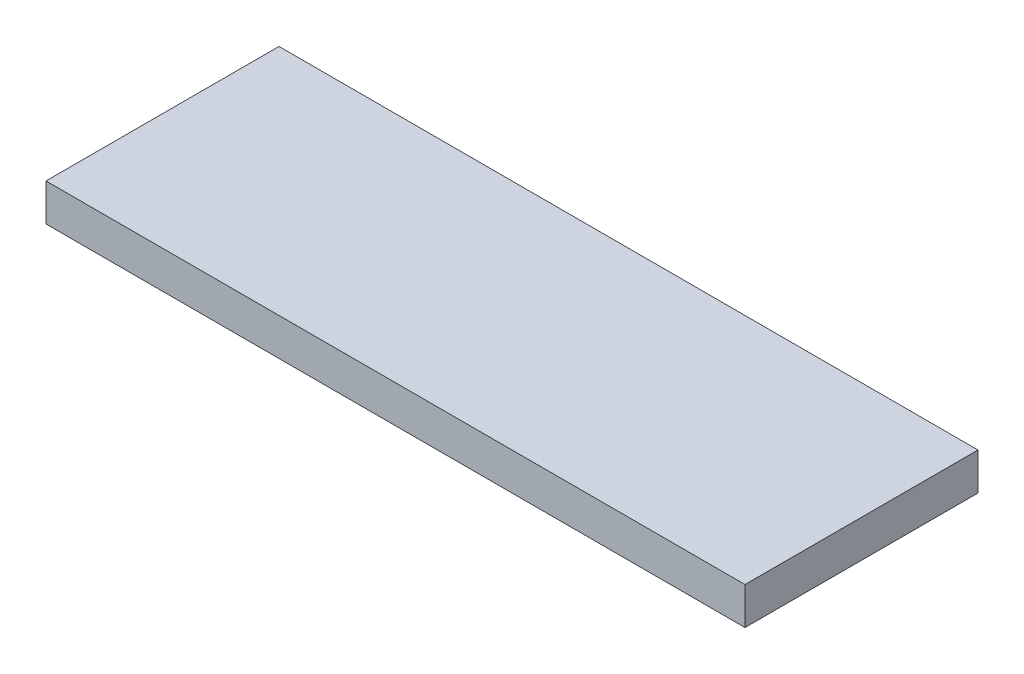
ISO-10303-21;
HEADER;
FILE_DESCRIPTION(('STEP AP214'),'2;1');
FILE_NAME('part.step','',(''),(''),'','','');
FILE_SCHEMA(('AUTOMOTIVE_DESIGN { 1 0 10303 214 1 1 1 1 }'));
ENDSEC;
DATA;
#1=APPLICATION_CONTEXT('core data for automotive mechanical design processes');
#2=APPLICATION_PROTOCOL_DEFINITION('international standard','automotive_design',2000,#1);
#3=PRODUCT_CONTEXT('',#1,'mechanical');
#4=PRODUCT('Part','Part','',(#3));
#5=PRODUCT_RELATED_PRODUCT_CATEGORY('part','',(#4));
#6=PRODUCT_DEFINITION_FORMATION('','',#4);
#7=PRODUCT_DEFINITION_CONTEXT('part definition',#1,'design');
#8=PRODUCT_DEFINITION('design','',#6,#7);
#9=PRODUCT_DEFINITION_SHAPE('','',#8);
#10=(LENGTH_UNIT() NAMED_UNIT(*) SI_UNIT(.MILLI.,.METRE.));
#11=(NAMED_UNIT(*) PLANE_ANGLE_UNIT() SI_UNIT($,.RADIAN.));
#12=(NAMED_UNIT(*) SI_UNIT($,.STERADIAN.) SOLID_ANGLE_UNIT());
#13=UNCERTAINTY_MEASURE_WITH_UNIT(LENGTH_MEASURE(1.E-05),#10,'distance_accuracy_value','');
#14=(GEOMETRIC_REPRESENTATION_CONTEXT(3) GLOBAL_UNCERTAINTY_ASSIGNED_CONTEXT((#13)) GLOBAL_UNIT_ASSIGNED_CONTEXT((#10,
#11,#12)) REPRESENTATION_CONTEXT('',''));
#15=CARTESIAN_POINT('',(0.,0.,0.));
#16=DIRECTION('',(0.,0.,1.));
#17=DIRECTION('',(1.,0.,0.));
#18=AXIS2_PLACEMENT_3D('',#15,#16,#17);
#19=CARTESIAN_POINT('',(-75.,8.,25.));
#20=DIRECTION('',(1.,0.,0.));
#21=DIRECTION('',(0.,0.,-1.));
#22=AXIS2_PLACEMENT_3D('',#19,#20,#21);
#23=PLANE('',#22);
#24=DIRECTION('',(0.,0.,1.));
#25=VECTOR('',#24,1.);
#26=CARTESIAN_POINT('',(-75.,0.,25.));
#27=LINE('',#26,#25);
#28=CARTESIAN_POINT('',(-75.,0.,-25.));
#29=VERTEX_POINT('',#28);
#30=CARTESIAN_POINT('',(-75.,0.,25.));
#31=VERTEX_POINT('',#30);
#32=EDGE_CURVE('E96',#29,#31,#27,.T.);
#33=ORIENTED_EDGE('',*,*,#32,.T.);
#34=DIRECTION('',(0.,-1.,0.));
#35=VECTOR('',#34,1.);
#36=CARTESIAN_POINT('',(-75.,8.,25.));
#37=LINE('',#36,#35);
#38=CARTESIAN_POINT('',(-75.,8.,25.));
#39=VERTEX_POINT('',#38);
#40=EDGE_CURVE('E11',#39,#31,#37,.T.);
#41=ORIENTED_EDGE('',*,*,#40,.F.);
#42=DIRECTION('',(0.,0.,1.));
#43=VECTOR('',#42,1.);
#44=CARTESIAN_POINT('',(-75.,8.,25.));
#45=LINE('',#44,#43);
#46=CARTESIAN_POINT('',(-75.,8.,-25.));
#47=VERTEX_POINT('',#46);
#48=EDGE_CURVE('E84',#47,#39,#45,.T.);
#49=ORIENTED_EDGE('',*,*,#48,.F.);
#50=DIRECTION('',(0.,-1.,0.));
#51=VECTOR('',#50,1.);
#52=CARTESIAN_POINT('',(-75.,8.,-25.));
#53=LINE('',#52,#51);
#54=EDGE_CURVE('E92',#47,#29,#53,.T.);
#55=ORIENTED_EDGE('',*,*,#54,.T.);
#56=EDGE_LOOP('',(#33,#41,#49,#55));
#57=FACE_BOUND('',#56,.T.);
#58=ADVANCED_FACE('F33',(#57),#23,.F.);
#59=CARTESIAN_POINT('',(75.,8.,25.));
#60=DIRECTION('',(0.,0.,-1.));
#61=DIRECTION('',(-1.,0.,0.));
#62=AXIS2_PLACEMENT_3D('',#59,#60,#61);
#63=PLANE('',#62);
#64=DIRECTION('',(1.,0.,0.));
#65=VECTOR('',#64,1.);
#66=CARTESIAN_POINT('',(75.,0.,25.));
#67=LINE('',#66,#65);
#68=CARTESIAN_POINT('',(75.,0.,25.));
#69=VERTEX_POINT('',#68);
#70=EDGE_CURVE('E88',#31,#69,#67,.T.);
#71=ORIENTED_EDGE('',*,*,#70,.T.);
#72=DIRECTION('',(0.,-1.,0.));
#73=VECTOR('',#72,1.);
#74=CARTESIAN_POINT('',(75.,8.,25.));
#75=LINE('',#74,#73);
#76=CARTESIAN_POINT('',(75.,8.,25.));
#77=VERTEX_POINT('',#76);
#78=EDGE_CURVE('E41',#77,#69,#75,.T.);
#79=ORIENTED_EDGE('',*,*,#78,.F.);
#80=DIRECTION('',(1.,0.,0.));
#81=VECTOR('',#80,1.);
#82=CARTESIAN_POINT('',(75.,8.,25.));
#83=LINE('',#82,#81);
#84=EDGE_CURVE('E79',#39,#77,#83,.T.);
#85=ORIENTED_EDGE('',*,*,#84,.F.);
#86=ORIENTED_EDGE('',*,*,#40,.T.);
#87=EDGE_LOOP('',(#71,#79,#85,#86));
#88=FACE_BOUND('',#87,.T.);
#89=ADVANCED_FACE('F87',(#88),#63,.F.);
#90=CARTESIAN_POINT('',(75.,8.,25.));
#91=DIRECTION('',(-1.,0.,0.));
#92=DIRECTION('',(0.,0.,1.));
#93=AXIS2_PLACEMENT_3D('',#90,#91,#92);
#94=PLANE('',#93);
#95=DIRECTION('',(0.,0.,-1.));
#96=VECTOR('',#95,1.);
#97=CARTESIAN_POINT('',(75.,0.,25.));
#98=LINE('',#97,#96);
#99=CARTESIAN_POINT('',(75.,0.,-25.));
#100=VERTEX_POINT('',#99);
#101=EDGE_CURVE('E66',#69,#100,#98,.T.);
#102=ORIENTED_EDGE('',*,*,#101,.T.);
#103=DIRECTION('',(0.,-1.,0.));
#104=VECTOR('',#103,1.);
#105=CARTESIAN_POINT('',(75.,8.,-25.));
#106=LINE('',#105,#104);
#107=CARTESIAN_POINT('',(75.,8.,-25.));
#108=VERTEX_POINT('',#107);
#109=EDGE_CURVE('E89',#108,#100,#106,.T.);
#110=ORIENTED_EDGE('',*,*,#109,.F.);
#111=DIRECTION('',(0.,0.,-1.));
#112=VECTOR('',#111,1.);
#113=CARTESIAN_POINT('',(75.,8.,25.));
#114=LINE('',#113,#112);
#115=EDGE_CURVE('E82',#77,#108,#114,.T.);
#116=ORIENTED_EDGE('',*,*,#115,.F.);
#117=ORIENTED_EDGE('',*,*,#78,.T.);
#118=EDGE_LOOP('',(#102,#110,#116,#117));
#119=FACE_BOUND('',#118,.T.);
#120=ADVANCED_FACE('F90',(#119),#94,.F.);
#121=CARTESIAN_POINT('',(75.,8.,-25.));
#122=DIRECTION('',(0.,0.,1.));
#123=DIRECTION('',(1.,0.,0.));
#124=AXIS2_PLACEMENT_3D('',#121,#122,#123);
#125=PLANE('',#124);
#126=DIRECTION('',(-1.,0.,0.));
#127=VECTOR('',#126,1.);
#128=CARTESIAN_POINT('',(75.,0.,-25.));
#129=LINE('',#128,#127);
#130=EDGE_CURVE('E72',#100,#29,#129,.T.);
#131=ORIENTED_EDGE('',*,*,#130,.T.);
#132=ORIENTED_EDGE('',*,*,#54,.F.);
#133=DIRECTION('',(-1.,0.,0.));
#134=VECTOR('',#133,1.);
#135=CARTESIAN_POINT('',(75.,8.,-25.));
#136=LINE('',#135,#134);
#137=EDGE_CURVE('E49',#108,#47,#136,.T.);
#138=ORIENTED_EDGE('',*,*,#137,.F.);
#139=ORIENTED_EDGE('',*,*,#109,.T.);
#140=EDGE_LOOP('',(#131,#132,#138,#139));
#141=FACE_BOUND('',#140,.T.);
#142=ADVANCED_FACE('F103',(#141),#125,.F.);
#143=CARTESIAN_POINT('',(0.,8.,0.));
#144=DIRECTION('',(0.,1.,0.));
#145=DIRECTION('',(0.,0.,1.));
#146=AXIS2_PLACEMENT_3D('',#143,#144,#145);
#147=PLANE('',#146);
#148=ORIENTED_EDGE('',*,*,#48,.T.);
#149=ORIENTED_EDGE('',*,*,#84,.T.);
#150=ORIENTED_EDGE('',*,*,#115,.T.);
#151=ORIENTED_EDGE('',*,*,#137,.T.);
#152=EDGE_LOOP('',(#148,#149,#150,#151));
#153=FACE_BOUND('',#152,.T.);
#154=ADVANCED_FACE('F80',(#153),#147,.T.);
#155=CARTESIAN_POINT('',(0.,0.,0.));
#156=DIRECTION('',(0.,1.,0.));
#157=DIRECTION('',(0.,0.,1.));
#158=AXIS2_PLACEMENT_3D('',#155,#156,#157);
#159=PLANE('',#158);
#160=ORIENTED_EDGE('',*,*,#32,.F.);
#161=ORIENTED_EDGE('',*,*,#130,.F.);
#162=ORIENTED_EDGE('',*,*,#101,.F.);
#163=ORIENTED_EDGE('',*,*,#70,.F.);
#164=EDGE_LOOP('',(#160,#161,#162,#163));
#165=FACE_BOUND('',#164,.T.);
#166=ADVANCED_FACE('F106',(#165),#159,.F.);
#167=CLOSED_SHELL('',(#58,#89,#120,#142,#154,#166));
#168=MANIFOLD_SOLID_BREP('B2',#167);
#169=ADVANCED_BREP_SHAPE_REPRESENTATION('',(#18,#168),#14);
#170=SHAPE_DEFINITION_REPRESENTATION(#9,#169);
ENDSEC;
END-ISO-10303-21;
